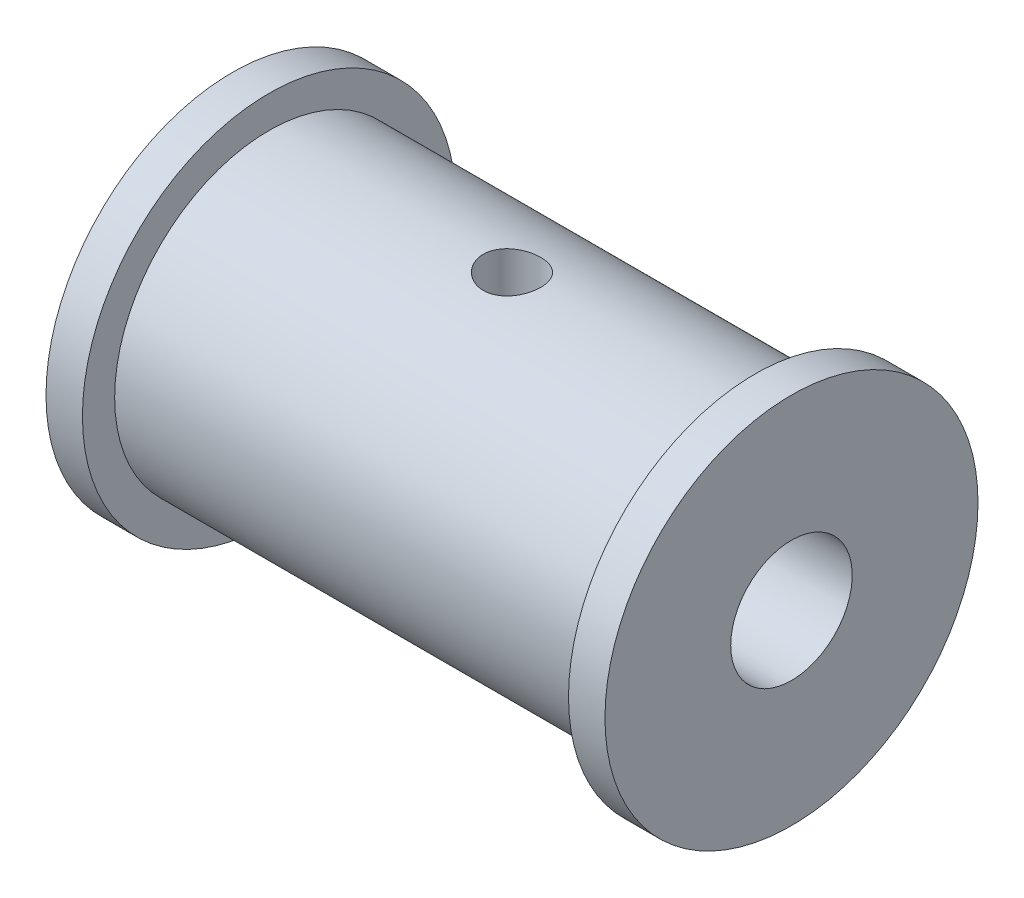
ISO-10303-21;
HEADER;
FILE_DESCRIPTION(('STEP AP214'),'2;1');
FILE_NAME('part.step','',(''),(''),'','','');
FILE_SCHEMA(('AUTOMOTIVE_DESIGN { 1 0 10303 214 1 1 1 1 }'));
ENDSEC;
DATA;
#1=APPLICATION_CONTEXT('core data for automotive mechanical design processes');
#2=APPLICATION_PROTOCOL_DEFINITION('international standard','automotive_design',2000,#1);
#3=PRODUCT_CONTEXT('',#1,'mechanical');
#4=PRODUCT('Part','Part','',(#3));
#5=PRODUCT_RELATED_PRODUCT_CATEGORY('part','',(#4));
#6=PRODUCT_DEFINITION_FORMATION('','',#4);
#7=PRODUCT_DEFINITION_CONTEXT('part definition',#1,'design');
#8=PRODUCT_DEFINITION('design','',#6,#7);
#9=PRODUCT_DEFINITION_SHAPE('','',#8);
#10=(LENGTH_UNIT() NAMED_UNIT(*) SI_UNIT(.MILLI.,.METRE.));
#11=(NAMED_UNIT(*) PLANE_ANGLE_UNIT() SI_UNIT($,.RADIAN.));
#12=(NAMED_UNIT(*) SI_UNIT($,.STERADIAN.) SOLID_ANGLE_UNIT());
#13=UNCERTAINTY_MEASURE_WITH_UNIT(LENGTH_MEASURE(1.E-05),#10,'distance_accuracy_value','');
#14=(GEOMETRIC_REPRESENTATION_CONTEXT(3) GLOBAL_UNCERTAINTY_ASSIGNED_CONTEXT((#13)) GLOBAL_UNIT_ASSIGNED_CONTEXT((#10,
#11,#12)) REPRESENTATION_CONTEXT('',''));
#15=CARTESIAN_POINT('',(0.,0.,0.));
#16=DIRECTION('',(0.,0.,1.));
#17=DIRECTION('',(1.,0.,0.));
#18=AXIS2_PLACEMENT_3D('',#15,#16,#17);
#19=CARTESIAN_POINT('',(-15.2755244755245,0.,0.));
#20=DIRECTION('',(-1.,0.,0.));
#21=DIRECTION('',(0.,0.,1.));
#22=AXIS2_PLACEMENT_3D('',#19,#20,#21);
#23=CYLINDRICAL_SURFACE('',#22,3.175);
#24=CARTESIAN_POINT('',(14.605,0.,0.));
#25=DIRECTION('',(-1.,0.,0.));
#26=DIRECTION('',(0.,0.,1.));
#27=AXIS2_PLACEMENT_3D('',#24,#25,#26);
#28=CIRCLE('',#27,3.175);
#29=CARTESIAN_POINT('',(14.605,0.,3.175));
#30=VERTEX_POINT('',#29);
#31=EDGE_CURVE('E72',#30,#30,#28,.T.);
#32=ORIENTED_EDGE('',*,*,#31,.F.);
#33=EDGE_LOOP('',(#32));
#34=FACE_BOUND('',#33,.T.);
#35=CARTESIAN_POINT('',(-14.605,0.,0.));
#36=DIRECTION('',(-1.,0.,0.));
#37=DIRECTION('',(0.,0.,1.));
#38=AXIS2_PLACEMENT_3D('',#35,#36,#37);
#39=CIRCLE('',#38,3.175);
#40=CARTESIAN_POINT('',(-14.605,0.,3.175));
#41=VERTEX_POINT('',#40);
#42=EDGE_CURVE('E66',#41,#41,#39,.T.);
#43=ORIENTED_EDGE('',*,*,#42,.T.);
#44=EDGE_LOOP('',(#43));
#45=FACE_BOUND('',#44,.T.);
#46=CARTESIAN_POINT('',(0.,2.7983253920872,-1.5));
#47=CARTESIAN_POINT('',(0.0788107476010317,2.79833097649977,-1.49999523547047));
#48=CARTESIAN_POINT('',(0.157735612205732,2.80170427159323,-1.49374832449328));
#49=CARTESIAN_POINT('',(0.313214667514685,2.81472644561665,-1.4690554061353));
#50=CARTESIAN_POINT('',(0.389762907162894,2.82438992585351,-1.45058101361493));
#51=CARTESIAN_POINT('',(0.537952673756733,2.84863009396432,-1.40237253355636));
#52=CARTESIAN_POINT('',(0.609616136431819,2.86318279906116,-1.37269332197988));
#53=CARTESIAN_POINT('',(0.74692939284759,2.89552502377023,-1.30308399064543));
#54=CARTESIAN_POINT('',(0.8125794422789,2.91331440566267,-1.26315430701281));
#55=CARTESIAN_POINT('',(0.941323245258398,2.95172227722859,-1.1707430871524));
#56=CARTESIAN_POINT('',(1.00387788849068,2.97245254188493,-1.11755658650795));
#57=CARTESIAN_POINT('',(1.11959143684936,3.01349951044786,-1.00161259672222));
#58=CARTESIAN_POINT('',(1.17274606260041,3.03381602228766,-0.938850772491945));
#59=CARTESIAN_POINT('',(1.27118937954777,3.07317288716969,-0.801034900704515));
#60=CARTESIAN_POINT('',(1.31583450125175,3.09206866660246,-0.725476017233364));
#61=CARTESIAN_POINT('',(1.39153752206176,3.12503381595021,-0.566861686619154));
#62=CARTESIAN_POINT('',(1.42260309774527,3.13910591174128,-0.483810507023549));
#63=CARTESIAN_POINT('',(1.46819431985617,3.16003750546179,-0.318263833167133));
#64=CARTESIAN_POINT('',(1.4836598006004,3.16730464125021,-0.23607983759682));
#65=CARTESIAN_POINT('',(1.50068669846295,3.17531500926786,-0.0699854874354078));
#66=CARTESIAN_POINT('',(1.50225551712034,3.17606171435844,0.0139239243031286));
#67=CARTESIAN_POINT('',(1.49185310738046,3.1711569999128,0.17410404695592));
#68=CARTESIAN_POINT('',(1.4809263684281,3.16599910390162,0.250460926307549));
#69=CARTESIAN_POINT('',(1.44768451199486,3.15058713309443,0.400106757592313));
#70=CARTESIAN_POINT('',(1.42536854800002,3.14033267949386,0.473395481043944));
#71=CARTESIAN_POINT('',(1.36978180811971,3.11549383971164,0.61616215999247));
#72=CARTESIAN_POINT('',(1.33635400002596,3.10084769916082,0.685567785451937));
#73=CARTESIAN_POINT('',(1.25968096352203,3.06858481389696,0.817962218284119));
#74=CARTESIAN_POINT('',(1.21643213988174,3.05096698193041,0.880948663490016));
#75=CARTESIAN_POINT('',(1.11701776567009,3.01265189942243,1.00453666893054));
#76=CARTESIAN_POINT('',(1.06005736803148,2.9918200943109,1.0644578414785));
#77=CARTESIAN_POINT('',(0.93699705964444,2.95046283361779,1.17424124933889));
#78=CARTESIAN_POINT('',(0.87089145595116,2.92993757775203,1.2240971710571));
#79=CARTESIAN_POINT('',(0.727172138151077,2.89039711066438,1.31484174230845));
#80=CARTESIAN_POINT('',(0.649138941996297,2.87151577260243,1.35512986365461));
#81=CARTESIAN_POINT('',(0.486283743531031,2.83914834140001,1.42170562946273));
#82=CARTESIAN_POINT('',(0.401468219875632,2.82565717160027,1.44800645544408));
#83=CARTESIAN_POINT('',(0.234253704737598,2.80697974613979,1.48387059914899));
#84=CARTESIAN_POINT('',(0.152157558069844,2.80124227464673,1.4945499135996));
#85=CARTESIAN_POINT('',(-0.0128364544628812,2.79714234532468,1.50221328025957));
#86=CARTESIAN_POINT('',(-0.0957338532268694,2.79877582206013,1.49920488189903));
#87=CARTESIAN_POINT('',(-0.25184110118071,2.80865284380239,1.4806017347564));
#88=CARTESIAN_POINT('',(-0.32523813353968,2.81627144126264,1.46619608896935));
#89=CARTESIAN_POINT('',(-0.468463633051388,2.83637948512089,1.42690562153975));
#90=CARTESIAN_POINT('',(-0.538291075738513,2.8488703210638,1.40201781025962));
#91=CARTESIAN_POINT('',(-0.676035807524976,2.87800314814948,1.3412324594274));
#92=CARTESIAN_POINT('',(-0.743715994140066,2.89481019393091,1.30487958898417));
#93=CARTESIAN_POINT('',(-0.872389828600745,2.93050507850425,1.22260967416881));
#94=CARTESIAN_POINT('',(-0.93338011780599,2.94939395301752,1.17668785898318));
#95=CARTESIAN_POINT('',(-1.05395122429284,2.98962533435876,1.07066250220429));
#96=CARTESIAN_POINT('',(-1.11263900919066,3.0110091844446,1.00955462247668));
#97=CARTESIAN_POINT('',(-1.2191662131219,3.05197816465585,0.877952835832725));
#98=CARTESIAN_POINT('',(-1.26700313884629,3.07156288076261,0.807456777596013));
#99=CARTESIAN_POINT('',(-1.35106340432696,3.10717258491727,0.657374049291596));
#100=CARTESIAN_POINT('',(-1.38708244177874,3.12313361565429,0.577656753882327));
#101=CARTESIAN_POINT('',(-1.44486593502356,3.14922093597641,0.412327293299583));
#102=CARTESIAN_POINT('',(-1.46664154231209,3.15935178938716,0.326719797872878));
#103=CARTESIAN_POINT('',(-1.49363889435459,3.17197971044583,0.159896332874223));
#104=CARTESIAN_POINT('',(-1.50011013632642,3.17505233840112,0.078925398284078));
#105=CARTESIAN_POINT('',(-1.49988711965684,3.17494636529876,-0.0829833461657175));
#106=CARTESIAN_POINT('',(-1.49319653511093,3.17176950877122,-0.163921158963004));
#107=CARTESIAN_POINT('',(-1.46770848023088,3.15985410378094,-0.318841842835547));
#108=CARTESIAN_POINT('',(-1.44959197491994,3.15142868675494,-0.392963167600614));
#109=CARTESIAN_POINT('',(-1.40262108547478,3.13010132928976,-0.537026434022491));
#110=CARTESIAN_POINT('',(-1.37376499240882,3.1171986764347,-0.60696770847403));
#111=CARTESIAN_POINT('',(-1.30473490189286,3.08738510301285,-0.744198443618439));
#112=CARTESIAN_POINT('',(-1.26410939390821,3.0703197298679,-0.811226286131094));
#113=CARTESIAN_POINT('',(-1.17328432091972,3.03405477724481,-0.937805412907553));
#114=CARTESIAN_POINT('',(-1.12308040855481,3.01485423033003,-0.997353281796323));
#115=CARTESIAN_POINT('',(-1.00928446778082,2.97425749382228,-1.11287613406119));
#116=CARTESIAN_POINT('',(-0.944896373173603,2.9528185885393,-1.16805442942683));
#117=CARTESIAN_POINT('',(-0.807312145748489,2.91171333700677,-1.26705651381277));
#118=CARTESIAN_POINT('',(-0.734109598744511,2.89204830000693,-1.31087196019013));
#119=CARTESIAN_POINT('',(-0.579232422210802,2.85663554941127,-1.3863737982034));
#120=CARTESIAN_POINT('',(-0.497439352525226,2.84095675906997,-1.41785130272302));
#121=CARTESIAN_POINT('',(-0.328811998329219,2.81635628214136,-1.4661232120466));
#122=CARTESIAN_POINT('',(-0.241995696672077,2.80741192483264,-1.48296690968124));
#123=CARTESIAN_POINT('',(-0.128694633247988,2.80116429672363,-1.49469268672873));
#124=CARTESIAN_POINT('',(-0.10301180774758,2.80010260103933,-1.49668048940514));
#125=CARTESIAN_POINT('',(-0.0515567295081782,2.79868221732461,-1.49933495903092));
#126=CARTESIAN_POINT('',(-0.0257844722890938,2.79832356503778,-1.50000155880871));
#127=CARTESIAN_POINT('',(0.,2.7983253920872,-1.5));
#128=B_SPLINE_CURVE_WITH_KNOTS('',3,(#46,#47,#48,#49,#50,#51,#52,#53,#54,#55,#56,#57,#58,#59,
#60,#61,#62,#63,#64,#65,#66,#67,#68,#69,#70,#71,#72,#73,#74,#75,#76,#77,#78,#79,#80,#81,#82,#83,
#84,#85,#86,#87,#88,#89,#90,#91,#92,#93,#94,#95,#96,#97,#98,#99,#100,#101,#102,#103,#104,#105,
#106,#107,#108,#109,#110,#111,#112,#113,#114,#115,#116,#117,#118,#119,#120,#121,#122,#123,#124,
#125,#126,#127),.UNSPECIFIED.,.T.,.F.,(4,2,2,2,2,2,2,2,2,2,2,2,2,2,2,2,2,2,2,2,2,2,2,2,2,2,2,2,
2,2,2,2,2,2,2,2,2,2,2,2,4),(0.,0.236323871838544,0.473198284289302,0.708927337380699,
0.944646362603916,1.19762429635865,1.45071710395354,1.71864285343498,1.98641694681215,
2.23687152724756,2.48719270436037,2.71802817018661,2.94888079555674,3.1831453100556,
3.41749572162706,3.67216706074964,3.92699765369087,4.19506898546716,4.46288723920479,
4.71043828617548,4.95785281342715,5.18239796950746,5.40700721193729,5.64198832122139,
5.87708686716682,6.13804637958085,6.39906579463174,6.66438519401193,6.92949661955738,
7.17207877892644,7.41459323161728,7.64386670961211,7.87317668624822,8.11282240294707,
8.35257714778319,8.61378861881715,8.87519133270404,9.14084608292566,9.40560248746477,
9.48291651801969,9.56023447921351),.UNSPECIFIED.);
#129=CARTESIAN_POINT('',(0.,2.7983253920872,-1.5));
#130=VERTEX_POINT('',#129);
#131=EDGE_CURVE('E92',#130,#130,#128,.T.);
#132=ORIENTED_EDGE('',*,*,#131,.F.);
#133=EDGE_LOOP('',(#132));
#134=FACE_BOUND('',#133,.T.);
#135=ADVANCED_FACE('F47',(#34,#45,#134),#23,.F.);
#136=CARTESIAN_POINT('',(-15.2755244755245,0.,0.));
#137=DIRECTION('',(-1.,0.,0.));
#138=DIRECTION('',(0.,0.,1.));
#139=AXIS2_PLACEMENT_3D('',#136,#137,#138);
#140=CYLINDRICAL_SURFACE('',#139,8.0645);
#141=CARTESIAN_POINT('',(-12.7,0.,0.));
#142=DIRECTION('',(-1.,0.,0.));
#143=DIRECTION('',(0.,0.,1.));
#144=AXIS2_PLACEMENT_3D('',#141,#142,#143);
#145=CIRCLE('',#144,8.0645);
#146=CARTESIAN_POINT('',(-12.7,0.,8.0645));
#147=VERTEX_POINT('',#146);
#148=EDGE_CURVE('E88',#147,#147,#145,.T.);
#149=ORIENTED_EDGE('',*,*,#148,.F.);
#150=EDGE_LOOP('',(#149));
#151=FACE_BOUND('',#150,.T.);
#152=CARTESIAN_POINT('',(12.7,0.,0.));
#153=DIRECTION('',(-1.,0.,0.));
#154=DIRECTION('',(0.,0.,1.));
#155=AXIS2_PLACEMENT_3D('',#152,#153,#154);
#156=CIRCLE('',#155,8.0645);
#157=CARTESIAN_POINT('',(12.7,0.,8.0645));
#158=VERTEX_POINT('',#157);
#159=EDGE_CURVE('E84',#158,#158,#156,.T.);
#160=ORIENTED_EDGE('',*,*,#159,.T.);
#161=EDGE_LOOP('',(#160));
#162=FACE_BOUND('',#161,.T.);
#163=CARTESIAN_POINT('',(0.,7.92377184489811,-1.5));
#164=CARTESIAN_POINT('',(0.08346999225124,7.9237734538727,-1.49999678574282));
#165=CARTESIAN_POINT('',(0.166981831122598,7.92510509008183,-1.49300912525413));
#166=CARTESIAN_POINT('',(0.331651557475362,7.93028125737973,-1.465261443805));
#167=CARTESIAN_POINT('',(0.412807373113565,7.93412793417546,-1.44448966269515));
#168=CARTESIAN_POINT('',(0.570358559424111,7.94388378807498,-1.38983296497414));
#169=CARTESIAN_POINT('',(0.646758254354492,7.94979105843547,-1.35596016807497));
#170=CARTESIAN_POINT('',(0.792785415471453,7.96300024226805,-1.27609492678907));
#171=CARTESIAN_POINT('',(0.862413427047705,7.97030204328437,-1.23010345954554));
#172=CARTESIAN_POINT('',(0.993779031686728,7.9855774618328,-1.12670590430802));
#173=CARTESIAN_POINT('',(1.05542163619568,7.99355757328761,-1.06918007561075));
#174=CARTESIAN_POINT('',(1.16823920190923,8.00923307476703,-0.944605532926529));
#175=CARTESIAN_POINT('',(1.21941348113181,8.0169284462149,-0.877556198991764));
#176=CARTESIAN_POINT('',(1.31020518495352,8.03123691251547,-0.735214641520338));
#177=CARTESIAN_POINT('',(1.34973313564861,8.03784146530635,-0.659864415440112));
#178=CARTESIAN_POINT('',(1.4155337793492,8.04915148284183,-0.503449338053651));
#179=CARTESIAN_POINT('',(1.44180754476066,8.05385710122446,-0.422384949689611));
#180=CARTESIAN_POINT('',(1.48006051144278,8.06079318837119,-0.257826787619601));
#181=CARTESIAN_POINT('',(1.49219980479087,8.06305135714503,-0.17437141552242));
#182=CARTESIAN_POINT('',(1.50233798434993,8.06493356258085,-0.00658004096476443));
#183=CARTESIAN_POINT('',(1.50033805628244,8.06455782012384,0.0777558870596309));
#184=CARTESIAN_POINT('',(1.48237749981114,8.06123620703969,0.243816740076963));
#185=CARTESIAN_POINT('',(1.46658924418254,8.05832207093516,0.325561034707383));
#186=CARTESIAN_POINT('',(1.42177273443912,8.0502866809281,0.485219503116541));
#187=CARTESIAN_POINT('',(1.39274400350547,8.04516534753988,0.563133538847228));
#188=CARTESIAN_POINT('',(1.32210579017994,8.03323788244329,0.713420735826199));
#189=CARTESIAN_POINT('',(1.28042724204538,8.02642253969638,0.785760673814137));
#190=CARTESIAN_POINT('',(1.18572336277713,8.01186102833994,0.922484388999932));
#191=CARTESIAN_POINT('',(1.13269689542425,8.0041147665555,0.986867368482127));
#192=CARTESIAN_POINT('',(1.01585206439317,7.98841171039542,1.10687065677505));
#193=CARTESIAN_POINT('',(0.951882907557722,7.98045350301508,1.16234405539621));
#194=CARTESIAN_POINT('',(0.815471301144276,7.9653353424318,1.26179684417697));
#195=CARTESIAN_POINT('',(0.743028731474736,7.95817540054528,1.305776071404));
#196=CARTESIAN_POINT('',(0.591533745322313,7.94546248569133,1.38103300471357));
#197=CARTESIAN_POINT('',(0.512470622228837,7.93991218309828,1.41228963841603));
#198=CARTESIAN_POINT('',(0.350088670254136,7.93108808617898,1.4610344761526));
#199=CARTESIAN_POINT('',(0.266770316402928,7.92781403833817,1.47852421348346));
#200=CARTESIAN_POINT('',(0.0995669829767135,7.92396322573631,1.49902487149708));
#201=CARTESIAN_POINT('',(0.0157087450574842,7.92334716793076,1.50224673307501));
#202=CARTESIAN_POINT('',(-0.151347559590066,7.92477697685847,1.49468538361545));
#203=CARTESIAN_POINT('',(-0.234545658220193,7.92682271416013,1.483902853551));
#204=CARTESIAN_POINT('',(-0.397228289082271,7.93330903129933,1.44881979239892));
#205=CARTESIAN_POINT('',(-0.47673746609808,7.93773005454083,1.42462960075962));
#206=CARTESIAN_POINT('',(-0.630574117098847,7.94845198992675,1.36353485958083));
#207=CARTESIAN_POINT('',(-0.704901214021849,7.95475303869108,1.326629386002));
#208=CARTESIAN_POINT('',(-0.847193844268481,7.96861467250661,1.24066526318392));
#209=CARTESIAN_POINT('',(-0.91507744549458,7.97618876284377,1.19147321412237));
#210=CARTESIAN_POINT('',(-1.04170287148394,7.99170496834265,1.08251244794541));
#211=CARTESIAN_POINT('',(-1.10044388710728,7.99964711599767,1.02274279568696));
#212=CARTESIAN_POINT('',(-1.20790342225976,8.0151306730024,0.893381906591112));
#213=CARTESIAN_POINT('',(-1.25648016441083,8.02266544854635,0.82367197704104));
#214=CARTESIAN_POINT('',(-1.34123220332478,8.03637407902485,0.676958042179703));
#215=CARTESIAN_POINT('',(-1.37740797217621,8.04254798576267,0.59995431467609));
#216=CARTESIAN_POINT('',(-1.43611829159826,8.05281069508312,0.441232587109995));
#217=CARTESIAN_POINT('',(-1.45872281202498,8.05691017535419,0.359541189147433));
#218=CARTESIAN_POINT('',(-1.4898724387586,8.06260765100307,0.193438057656404));
#219=CARTESIAN_POINT('',(-1.49841899979037,8.0642059052082,0.109026606522252));
#220=CARTESIAN_POINT('',(-1.50116011764579,8.06471581480838,-0.0587601988743187));
#221=CARTESIAN_POINT('',(-1.49556892499499,8.06366757682714,-0.142132006832127));
#222=CARTESIAN_POINT('',(-1.47066205121671,8.05908551327764,-0.306726317994638));
#223=CARTESIAN_POINT('',(-1.4513464971752,8.0555517107254,-0.387948841094244));
#224=CARTESIAN_POINT('',(-1.39962888793001,8.04639542707254,-0.545828097106256));
#225=CARTESIAN_POINT('',(-1.36724929448123,8.04077653231502,-0.622492408935781));
#226=CARTESIAN_POINT('',(-1.29034827815016,8.02805870428464,-0.769331984483264));
#227=CARTESIAN_POINT('',(-1.24582605920632,8.02095967398239,-0.839506822352059));
#228=CARTESIAN_POINT('',(-1.14516445600538,8.00593885136061,-0.972443982416024));
#229=CARTESIAN_POINT('',(-1.08887011890436,7.99800686931814,-1.03508783461836));
#230=CARTESIAN_POINT('',(-0.966584123846522,7.98227889621537,-1.15011418262556));
#231=CARTESIAN_POINT('',(-0.900590189522322,7.97448293755975,-1.20249426290747));
#232=CARTESIAN_POINT('',(-0.760061658823829,7.9598323995185,-1.29595246341368));
#233=CARTESIAN_POINT('',(-0.68545494399561,7.95298701211059,-1.33692362626079));
#234=CARTESIAN_POINT('',(-0.530314527576079,7.94112310521889,-1.40568546223609));
#235=CARTESIAN_POINT('',(-0.449786529692779,7.93610285467355,-1.43348863224149));
#236=CARTESIAN_POINT('',(-0.307512315550241,7.92950950462025,-1.46944509356762));
#237=CARTESIAN_POINT('',(-0.246601375268743,7.92737059720409,-1.480883642522));
#238=CARTESIAN_POINT('',(-0.123801280193672,7.92450118925832,-1.49616218729631));
#239=CARTESIAN_POINT('',(-0.0619121513189706,7.92377065147428,-1.50000238410921));
#240=CARTESIAN_POINT('',(0.,7.92377184489811,-1.5));
#241=B_SPLINE_CURVE_WITH_KNOTS('',3,(#163,#164,#165,#166,#167,#168,#169,#170,#171,#172,#173,
#174,#175,#176,#177,#178,#179,#180,#181,#182,#183,#184,#185,#186,#187,#188,#189,#190,#191,#192,
#193,#194,#195,#196,#197,#198,#199,#200,#201,#202,#203,#204,#205,#206,#207,#208,#209,#210,#211,
#212,#213,#214,#215,#216,#217,#218,#219,#220,#221,#222,#223,#224,#225,#226,#227,#228,#229,#230,
#231,#232,#233,#234,#235,#236,#237,#238,#239,#240),.UNSPECIFIED.,.T.,.F.,(4,2,2,2,2,2,2,2,2,2,2,
2,2,2,2,2,2,2,2,2,2,2,2,2,2,2,2,2,2,2,2,2,2,2,2,2,2,2,4),(0.,0.250183421207042,
0.500580565413789,0.750746619866986,1.00089250929468,1.25378386865681,1.50669169793819,
1.76149467250217,2.01627702746063,2.2681446572832,2.51999116562211,2.76873360564692,
3.01748500414491,3.26761974750813,3.51777954753311,3.77171474877918,4.02565354942093,
4.28001125295198,4.53434062322397,4.78489707662494,5.03544134700442,5.28395371670109,
5.53248414998902,5.78384013794753,6.03521835885676,6.28989837637596,6.54456869748887,
6.79791446964375,7.05123402379814,7.30073772756839,7.55023912099375,7.79931334807523,
8.0484039082057,8.30100669993306,8.55366886914115,8.808625562021,9.06333980498248,
9.24891312490274,9.43448153593896),.UNSPECIFIED.);
#242=CARTESIAN_POINT('',(0.,7.92377184489811,-1.5));
#243=VERTEX_POINT('',#242);
#244=EDGE_CURVE('E51',#243,#243,#241,.T.);
#245=ORIENTED_EDGE('',*,*,#244,.T.);
#246=EDGE_LOOP('',(#245));
#247=FACE_BOUND('',#246,.T.);
#248=ADVANCED_FACE('F107',(#151,#162,#247),#140,.T.);
#249=CARTESIAN_POINT('',(-12.7,0.,0.));
#250=DIRECTION('',(1.,0.,0.));
#251=DIRECTION('',(0.,0.,-1.));
#252=AXIS2_PLACEMENT_3D('',#249,#250,#251);
#253=PLANE('',#252);
#254=ORIENTED_EDGE('',*,*,#148,.T.);
#255=EDGE_LOOP('',(#254));
#256=FACE_BOUND('',#255,.T.);
#257=CARTESIAN_POINT('',(-12.7,0.,0.));
#258=DIRECTION('',(-1.,0.,0.));
#259=DIRECTION('',(0.,0.,1.));
#260=AXIS2_PLACEMENT_3D('',#257,#258,#259);
#261=CIRCLE('',#260,9.74725);
#262=CARTESIAN_POINT('',(-12.7,0.,9.74725));
#263=VERTEX_POINT('',#262);
#264=EDGE_CURVE('E10',#263,#263,#261,.T.);
#265=ORIENTED_EDGE('',*,*,#264,.F.);
#266=EDGE_LOOP('',(#265));
#267=FACE_BOUND('',#266,.T.);
#268=ADVANCED_FACE('F49',(#256,#267),#253,.T.);
#269=CARTESIAN_POINT('',(-15.2755244755245,0.,0.));
#270=DIRECTION('',(-1.,0.,0.));
#271=DIRECTION('',(0.,0.,1.));
#272=AXIS2_PLACEMENT_3D('',#269,#270,#271);
#273=CYLINDRICAL_SURFACE('',#272,9.74725);
#274=ORIENTED_EDGE('',*,*,#264,.T.);
#275=EDGE_LOOP('',(#274));
#276=FACE_BOUND('',#275,.T.);
#277=CARTESIAN_POINT('',(-14.605,0.,0.));
#278=DIRECTION('',(-1.,0.,0.));
#279=DIRECTION('',(0.,0.,1.));
#280=AXIS2_PLACEMENT_3D('',#277,#278,#279);
#281=CIRCLE('',#280,9.74725);
#282=CARTESIAN_POINT('',(-14.605,0.,9.74725));
#283=VERTEX_POINT('',#282);
#284=EDGE_CURVE('E61',#283,#283,#281,.T.);
#285=ORIENTED_EDGE('',*,*,#284,.F.);
#286=EDGE_LOOP('',(#285));
#287=FACE_BOUND('',#286,.T.);
#288=ADVANCED_FACE('F126',(#276,#287),#273,.T.);
#289=CARTESIAN_POINT('',(-14.605,0.,0.));
#290=DIRECTION('',(1.,0.,0.));
#291=DIRECTION('',(0.,0.,-1.));
#292=AXIS2_PLACEMENT_3D('',#289,#290,#291);
#293=PLANE('',#292);
#294=ORIENTED_EDGE('',*,*,#42,.F.);
#295=EDGE_LOOP('',(#294));
#296=FACE_BOUND('',#295,.T.);
#297=ORIENTED_EDGE('',*,*,#284,.T.);
#298=EDGE_LOOP('',(#297));
#299=FACE_BOUND('',#298,.T.);
#300=ADVANCED_FACE('F121',(#296,#299),#293,.F.);
#301=CARTESIAN_POINT('',(14.605,0.,0.));
#302=DIRECTION('',(1.,0.,0.));
#303=DIRECTION('',(0.,0.,-1.));
#304=AXIS2_PLACEMENT_3D('',#301,#302,#303);
#305=PLANE('',#304);
#306=ORIENTED_EDGE('',*,*,#31,.T.);
#307=EDGE_LOOP('',(#306));
#308=FACE_BOUND('',#307,.T.);
#309=CARTESIAN_POINT('',(14.605,0.,0.));
#310=DIRECTION('',(-1.,0.,0.));
#311=DIRECTION('',(0.,0.,1.));
#312=AXIS2_PLACEMENT_3D('',#309,#310,#311);
#313=CIRCLE('',#312,9.74725);
#314=CARTESIAN_POINT('',(14.605,0.,9.74725));
#315=VERTEX_POINT('',#314);
#316=EDGE_CURVE('E76',#315,#315,#313,.T.);
#317=ORIENTED_EDGE('',*,*,#316,.F.);
#318=EDGE_LOOP('',(#317));
#319=FACE_BOUND('',#318,.T.);
#320=ADVANCED_FACE('F118',(#308,#319),#305,.T.);
#321=CARTESIAN_POINT('',(-15.2755244755245,0.,0.));
#322=DIRECTION('',(-1.,0.,0.));
#323=DIRECTION('',(0.,0.,1.));
#324=AXIS2_PLACEMENT_3D('',#321,#322,#323);
#325=CYLINDRICAL_SURFACE('',#324,9.74725);
#326=CARTESIAN_POINT('',(12.7,0.,0.));
#327=DIRECTION('',(-1.,0.,0.));
#328=DIRECTION('',(0.,0.,1.));
#329=AXIS2_PLACEMENT_3D('',#326,#327,#328);
#330=CIRCLE('',#329,9.74725);
#331=CARTESIAN_POINT('',(12.7,0.,9.74725));
#332=VERTEX_POINT('',#331);
#333=EDGE_CURVE('E80',#332,#332,#330,.T.);
#334=ORIENTED_EDGE('',*,*,#333,.F.);
#335=EDGE_LOOP('',(#334));
#336=FACE_BOUND('',#335,.T.);
#337=ORIENTED_EDGE('',*,*,#316,.T.);
#338=EDGE_LOOP('',(#337));
#339=FACE_BOUND('',#338,.T.);
#340=ADVANCED_FACE('F115',(#336,#339),#325,.T.);
#341=CARTESIAN_POINT('',(12.7,0.,0.));
#342=DIRECTION('',(1.,0.,0.));
#343=DIRECTION('',(0.,0.,-1.));
#344=AXIS2_PLACEMENT_3D('',#341,#342,#343);
#345=PLANE('',#344);
#346=ORIENTED_EDGE('',*,*,#159,.F.);
#347=EDGE_LOOP('',(#346));
#348=FACE_BOUND('',#347,.T.);
#349=ORIENTED_EDGE('',*,*,#333,.T.);
#350=EDGE_LOOP('',(#349));
#351=FACE_BOUND('',#350,.T.);
#352=ADVANCED_FACE('F105',(#348,#351),#345,.F.);
#353=CARTESIAN_POINT('',(0.,9.74725,0.));
#354=DIRECTION('',(0.,-1.,0.));
#355=DIRECTION('',(0.,0.,-1.));
#356=AXIS2_PLACEMENT_3D('',#353,#354,#355);
#357=CYLINDRICAL_SURFACE('',#356,1.5);
#358=ORIENTED_EDGE('',*,*,#244,.F.);
#359=EDGE_LOOP('',(#358));
#360=FACE_BOUND('',#359,.T.);
#361=ORIENTED_EDGE('',*,*,#131,.T.);
#362=EDGE_LOOP('',(#361));
#363=FACE_BOUND('',#362,.T.);
#364=ADVANCED_FACE('F102',(#360,#363),#357,.F.);
#365=CLOSED_SHELL('',(#135,#248,#268,#288,#300,#320,#340,#352,#364));
#366=MANIFOLD_SOLID_BREP('B2',#365);
#367=ADVANCED_BREP_SHAPE_REPRESENTATION('',(#18,#366),#14);
#368=SHAPE_DEFINITION_REPRESENTATION(#9,#367);
ENDSEC;
END-ISO-10303-21;
